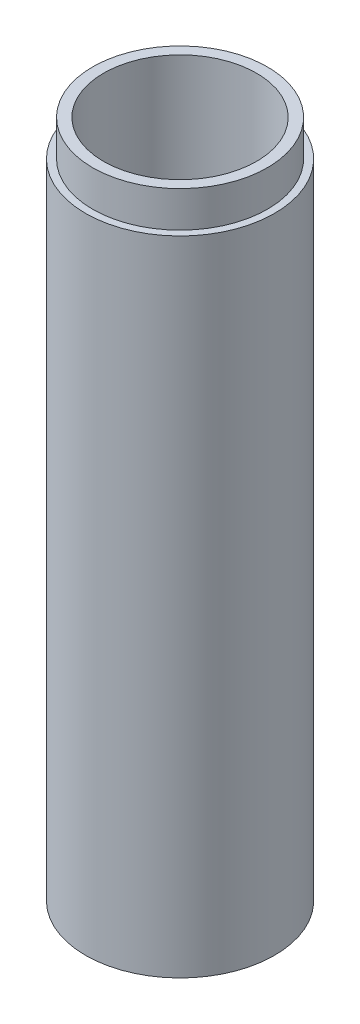
ISO-10303-21;
HEADER;
FILE_DESCRIPTION(('STEP AP214'),'2;1');
FILE_NAME('part.step','',(''),(''),'','','');
FILE_SCHEMA(('AUTOMOTIVE_DESIGN { 1 0 10303 214 1 1 1 1 }'));
ENDSEC;
DATA;
#1=APPLICATION_CONTEXT('core data for automotive mechanical design processes');
#2=APPLICATION_PROTOCOL_DEFINITION('international standard','automotive_design',2000,#1);
#3=PRODUCT_CONTEXT('',#1,'mechanical');
#4=PRODUCT('Part','Part','',(#3));
#5=PRODUCT_RELATED_PRODUCT_CATEGORY('part','',(#4));
#6=PRODUCT_DEFINITION_FORMATION('','',#4);
#7=PRODUCT_DEFINITION_CONTEXT('part definition',#1,'design');
#8=PRODUCT_DEFINITION('design','',#6,#7);
#9=PRODUCT_DEFINITION_SHAPE('','',#8);
#10=(LENGTH_UNIT() NAMED_UNIT(*) SI_UNIT(.MILLI.,.METRE.));
#11=(NAMED_UNIT(*) PLANE_ANGLE_UNIT() SI_UNIT($,.RADIAN.));
#12=(NAMED_UNIT(*) SI_UNIT($,.STERADIAN.) SOLID_ANGLE_UNIT());
#13=UNCERTAINTY_MEASURE_WITH_UNIT(LENGTH_MEASURE(1.E-05),#10,'distance_accuracy_value','');
#14=(GEOMETRIC_REPRESENTATION_CONTEXT(3) GLOBAL_UNCERTAINTY_ASSIGNED_CONTEXT((#13)) GLOBAL_UNIT_ASSIGNED_CONTEXT((#10,
#11,#12)) REPRESENTATION_CONTEXT('',''));
#15=CARTESIAN_POINT('',(0.,0.,0.));
#16=DIRECTION('',(0.,0.,1.));
#17=DIRECTION('',(1.,0.,0.));
#18=AXIS2_PLACEMENT_3D('',#15,#16,#17);
#19=CARTESIAN_POINT('',(10.11875,0.,0.));
#20=DIRECTION('',(0.,1.,0.));
#21=DIRECTION('',(0.,0.,1.));
#22=AXIS2_PLACEMENT_3D('',#19,#20,#21);
#23=PLANE('',#22);
#24=CARTESIAN_POINT('',(0.,0.,0.));
#25=DIRECTION('',(0.,1.,0.));
#26=DIRECTION('',(0.,0.,1.));
#27=AXIS2_PLACEMENT_3D('',#24,#25,#26);
#28=CIRCLE('',#27,12.5);
#29=CARTESIAN_POINT('',(0.,0.,12.5));
#30=VERTEX_POINT('',#29);
#31=EDGE_CURVE('E10',#30,#30,#28,.T.);
#32=ORIENTED_EDGE('',*,*,#31,.F.);
#33=EDGE_LOOP('',(#32));
#34=FACE_BOUND('',#33,.T.);
#35=ADVANCED_FACE('F37',(#34),#23,.F.);
#36=CARTESIAN_POINT('',(0.,96.789249837815,0.));
#37=DIRECTION('',(0.,1.,0.));
#38=DIRECTION('',(0.,0.,1.));
#39=AXIS2_PLACEMENT_3D('',#36,#37,#38);
#40=CYLINDRICAL_SURFACE('',#39,12.5);
#41=CARTESIAN_POINT('',(0.,85.,0.));
#42=DIRECTION('',(0.,1.,0.));
#43=DIRECTION('',(0.,0.,1.));
#44=AXIS2_PLACEMENT_3D('',#41,#42,#43);
#45=CIRCLE('',#44,12.5);
#46=CARTESIAN_POINT('',(0.,85.,12.5));
#47=VERTEX_POINT('',#46);
#48=EDGE_CURVE('E44',#47,#47,#45,.T.);
#49=ORIENTED_EDGE('',*,*,#48,.F.);
#50=EDGE_LOOP('',(#49));
#51=FACE_BOUND('',#50,.T.);
#52=ORIENTED_EDGE('',*,*,#31,.T.);
#53=EDGE_LOOP('',(#52));
#54=FACE_BOUND('',#53,.T.);
#55=ADVANCED_FACE('F91',(#51,#54),#40,.T.);
#56=CARTESIAN_POINT('',(11.55813899011,85.,0.));
#57=DIRECTION('',(0.,-1.,0.));
#58=DIRECTION('',(0.,0.,-1.));
#59=AXIS2_PLACEMENT_3D('',#56,#57,#58);
#60=PLANE('',#59);
#61=CARTESIAN_POINT('',(0.,85.,0.));
#62=DIRECTION('',(0.,1.,0.));
#63=DIRECTION('',(0.,0.,1.));
#64=AXIS2_PLACEMENT_3D('',#61,#62,#63);
#65=CIRCLE('',#64,11.55813899011);
#66=CARTESIAN_POINT('',(0.,85.,11.55813899011));
#67=VERTEX_POINT('',#66);
#68=EDGE_CURVE('E49',#67,#67,#65,.T.);
#69=ORIENTED_EDGE('',*,*,#68,.F.);
#70=EDGE_LOOP('',(#69));
#71=FACE_BOUND('',#70,.T.);
#72=ORIENTED_EDGE('',*,*,#48,.T.);
#73=EDGE_LOOP('',(#72));
#74=FACE_BOUND('',#73,.T.);
#75=ADVANCED_FACE('F86',(#71,#74),#60,.F.);
#76=CARTESIAN_POINT('',(0.,96.789249837815,0.));
#77=DIRECTION('',(0.,1.,0.));
#78=DIRECTION('',(0.,0.,1.));
#79=AXIS2_PLACEMENT_3D('',#76,#77,#78);
#80=CYLINDRICAL_SURFACE('',#79,11.55813899011);
#81=CARTESIAN_POINT('',(0.,89.7625,0.));
#82=DIRECTION('',(0.,1.,0.));
#83=DIRECTION('',(0.,0.,1.));
#84=AXIS2_PLACEMENT_3D('',#81,#82,#83);
#85=CIRCLE('',#84,11.55813899011);
#86=CARTESIAN_POINT('',(0.,89.7625,11.55813899011));
#87=VERTEX_POINT('',#86);
#88=EDGE_CURVE('E54',#87,#87,#85,.T.);
#89=ORIENTED_EDGE('',*,*,#88,.F.);
#90=EDGE_LOOP('',(#89));
#91=FACE_BOUND('',#90,.T.);
#92=ORIENTED_EDGE('',*,*,#68,.T.);
#93=EDGE_LOOP('',(#92));
#94=FACE_BOUND('',#93,.T.);
#95=ADVANCED_FACE('F80',(#91,#94),#80,.T.);
#96=CARTESIAN_POINT('',(11.55813899011,89.7625,0.));
#97=DIRECTION('',(0.,-1.,0.));
#98=DIRECTION('',(0.,0.,-1.));
#99=AXIS2_PLACEMENT_3D('',#96,#97,#98);
#100=PLANE('',#99);
#101=CARTESIAN_POINT('',(0.,89.7625,0.));
#102=DIRECTION('',(0.,1.,0.));
#103=DIRECTION('',(0.,0.,1.));
#104=AXIS2_PLACEMENT_3D('',#101,#102,#103);
#105=CIRCLE('',#104,10.11875);
#106=CARTESIAN_POINT('',(0.,89.7625,10.11875));
#107=VERTEX_POINT('',#106);
#108=EDGE_CURVE('E60',#107,#107,#105,.T.);
#109=ORIENTED_EDGE('',*,*,#108,.F.);
#110=EDGE_LOOP('',(#109));
#111=FACE_BOUND('',#110,.T.);
#112=ORIENTED_EDGE('',*,*,#88,.T.);
#113=EDGE_LOOP('',(#112));
#114=FACE_BOUND('',#113,.T.);
#115=ADVANCED_FACE('F74',(#111,#114),#100,.F.);
#116=CARTESIAN_POINT('',(0.,96.789249837815,0.));
#117=DIRECTION('',(0.,1.,0.));
#118=DIRECTION('',(0.,0.,1.));
#119=AXIS2_PLACEMENT_3D('',#116,#117,#118);
#120=CYLINDRICAL_SURFACE('',#119,10.11875);
#121=CARTESIAN_POINT('',(0.,2.38125,0.));
#122=DIRECTION('',(0.,1.,0.));
#123=DIRECTION('',(0.,0.,1.));
#124=AXIS2_PLACEMENT_3D('',#121,#122,#123);
#125=CIRCLE('',#124,10.11875);
#126=CARTESIAN_POINT('',(0.,2.38125,10.11875));
#127=VERTEX_POINT('',#126);
#128=EDGE_CURVE('E64',#127,#127,#125,.T.);
#129=ORIENTED_EDGE('',*,*,#128,.F.);
#130=EDGE_LOOP('',(#129));
#131=FACE_BOUND('',#130,.T.);
#132=ORIENTED_EDGE('',*,*,#108,.T.);
#133=EDGE_LOOP('',(#132));
#134=FACE_BOUND('',#133,.T.);
#135=ADVANCED_FACE('F71',(#131,#134),#120,.F.);
#136=CARTESIAN_POINT('',(0.,2.38125,0.));
#137=DIRECTION('',(0.,-1.,0.));
#138=DIRECTION('',(0.,0.,-1.));
#139=AXIS2_PLACEMENT_3D('',#136,#137,#138);
#140=PLANE('',#139);
#141=ORIENTED_EDGE('',*,*,#128,.T.);
#142=EDGE_LOOP('',(#141));
#143=FACE_BOUND('',#142,.T.);
#144=ADVANCED_FACE('F69',(#143),#140,.F.);
#145=CLOSED_SHELL('',(#35,#55,#75,#95,#115,#135,#144));
#146=MANIFOLD_SOLID_BREP('B2',#145);
#147=ADVANCED_BREP_SHAPE_REPRESENTATION('',(#18,#146),#14);
#148=SHAPE_DEFINITION_REPRESENTATION(#9,#147);
ENDSEC;
END-ISO-10303-21;
